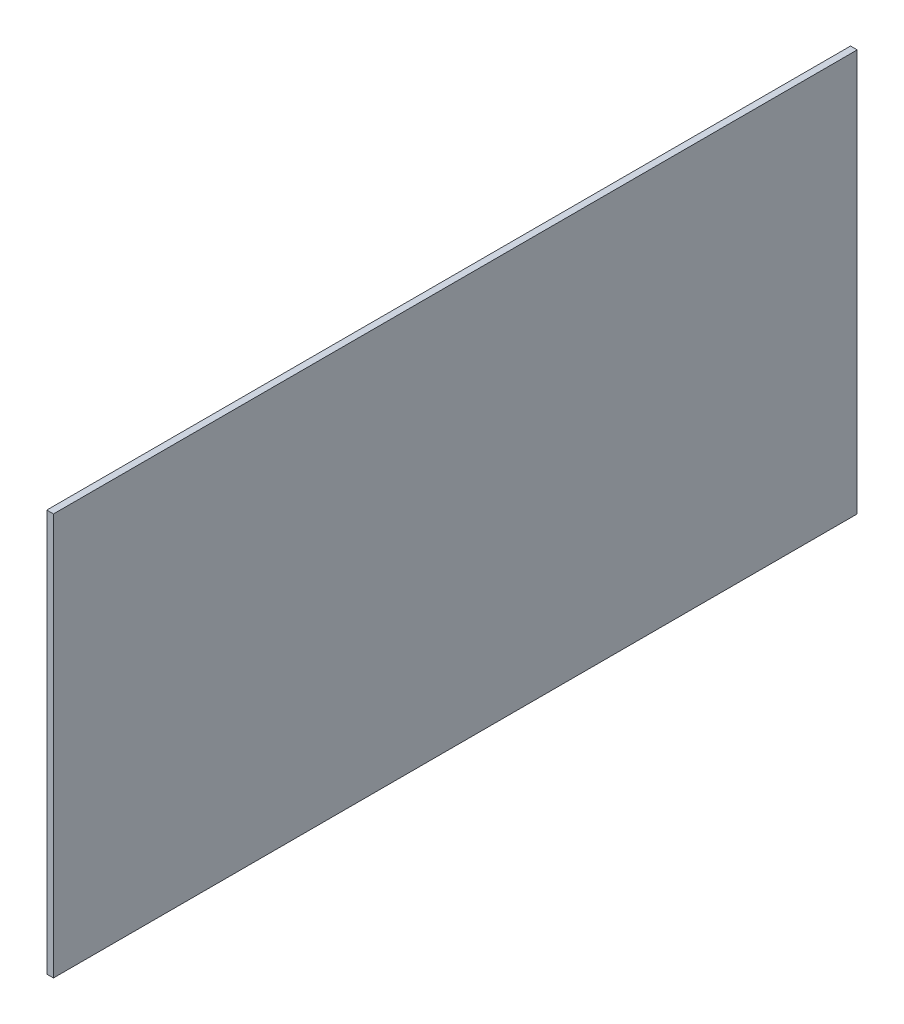
ISO-10303-21;
HEADER;
FILE_DESCRIPTION(('STEP AP214'),'2;1');
FILE_NAME('part.step','',(''),(''),'','','');
FILE_SCHEMA(('AUTOMOTIVE_DESIGN { 1 0 10303 214 1 1 1 1 }'));
ENDSEC;
DATA;
#1=APPLICATION_CONTEXT('core data for automotive mechanical design processes');
#2=APPLICATION_PROTOCOL_DEFINITION('international standard','automotive_design',2000,#1);
#3=PRODUCT_CONTEXT('',#1,'mechanical');
#4=PRODUCT('Part','Part','',(#3));
#5=PRODUCT_RELATED_PRODUCT_CATEGORY('part','',(#4));
#6=PRODUCT_DEFINITION_FORMATION('','',#4);
#7=PRODUCT_DEFINITION_CONTEXT('part definition',#1,'design');
#8=PRODUCT_DEFINITION('design','',#6,#7);
#9=PRODUCT_DEFINITION_SHAPE('','',#8);
#10=(LENGTH_UNIT() NAMED_UNIT(*) SI_UNIT(.MILLI.,.METRE.));
#11=(NAMED_UNIT(*) PLANE_ANGLE_UNIT() SI_UNIT($,.RADIAN.));
#12=(NAMED_UNIT(*) SI_UNIT($,.STERADIAN.) SOLID_ANGLE_UNIT());
#13=UNCERTAINTY_MEASURE_WITH_UNIT(LENGTH_MEASURE(1.E-05),#10,'distance_accuracy_value','');
#14=(GEOMETRIC_REPRESENTATION_CONTEXT(3) GLOBAL_UNCERTAINTY_ASSIGNED_CONTEXT((#13)) GLOBAL_UNIT_ASSIGNED_CONTEXT((#10,
#11,#12)) REPRESENTATION_CONTEXT('',''));
#15=CARTESIAN_POINT('',(0.,0.,0.));
#16=DIRECTION('',(0.,0.,1.));
#17=DIRECTION('',(1.,0.,0.));
#18=AXIS2_PLACEMENT_3D('',#15,#16,#17);
#19=CARTESIAN_POINT('',(5.,-150.,300.));
#20=DIRECTION('',(0.,0.,-1.));
#21=DIRECTION('',(-1.,0.,0.));
#22=AXIS2_PLACEMENT_3D('',#19,#20,#21);
#23=PLANE('',#22);
#24=DIRECTION('',(0.,-1.,0.));
#25=VECTOR('',#24,1.);
#26=CARTESIAN_POINT('',(0.,-150.,300.));
#27=LINE('',#26,#25);
#28=CARTESIAN_POINT('',(0.,150.,300.));
#29=VERTEX_POINT('',#28);
#30=CARTESIAN_POINT('',(0.,-150.,300.));
#31=VERTEX_POINT('',#30);
#32=EDGE_CURVE('E96',#29,#31,#27,.T.);
#33=ORIENTED_EDGE('',*,*,#32,.T.);
#34=DIRECTION('',(-1.,0.,0.));
#35=VECTOR('',#34,1.);
#36=CARTESIAN_POINT('',(5.,-150.,300.));
#37=LINE('',#36,#35);
#38=CARTESIAN_POINT('',(5.,-150.,300.));
#39=VERTEX_POINT('',#38);
#40=EDGE_CURVE('E11',#39,#31,#37,.T.);
#41=ORIENTED_EDGE('',*,*,#40,.F.);
#42=DIRECTION('',(0.,-1.,0.));
#43=VECTOR('',#42,1.);
#44=CARTESIAN_POINT('',(5.,-150.,300.));
#45=LINE('',#44,#43);
#46=CARTESIAN_POINT('',(5.,150.,300.));
#47=VERTEX_POINT('',#46);
#48=EDGE_CURVE('E84',#47,#39,#45,.T.);
#49=ORIENTED_EDGE('',*,*,#48,.F.);
#50=DIRECTION('',(-1.,0.,0.));
#51=VECTOR('',#50,1.);
#52=CARTESIAN_POINT('',(5.,150.,300.));
#53=LINE('',#52,#51);
#54=EDGE_CURVE('E92',#47,#29,#53,.T.);
#55=ORIENTED_EDGE('',*,*,#54,.T.);
#56=EDGE_LOOP('',(#33,#41,#49,#55));
#57=FACE_BOUND('',#56,.T.);
#58=ADVANCED_FACE('F33',(#57),#23,.F.);
#59=CARTESIAN_POINT('',(5.,-150.,-300.));
#60=DIRECTION('',(0.,1.,0.));
#61=DIRECTION('',(0.,0.,1.));
#62=AXIS2_PLACEMENT_3D('',#59,#60,#61);
#63=PLANE('',#62);
#64=DIRECTION('',(0.,0.,-1.));
#65=VECTOR('',#64,1.);
#66=CARTESIAN_POINT('',(0.,-150.,-300.));
#67=LINE('',#66,#65);
#68=CARTESIAN_POINT('',(0.,-150.,-300.));
#69=VERTEX_POINT('',#68);
#70=EDGE_CURVE('E88',#31,#69,#67,.T.);
#71=ORIENTED_EDGE('',*,*,#70,.T.);
#72=DIRECTION('',(-1.,0.,0.));
#73=VECTOR('',#72,1.);
#74=CARTESIAN_POINT('',(5.,-150.,-300.));
#75=LINE('',#74,#73);
#76=CARTESIAN_POINT('',(5.,-150.,-300.));
#77=VERTEX_POINT('',#76);
#78=EDGE_CURVE('E41',#77,#69,#75,.T.);
#79=ORIENTED_EDGE('',*,*,#78,.F.);
#80=DIRECTION('',(0.,0.,-1.));
#81=VECTOR('',#80,1.);
#82=CARTESIAN_POINT('',(5.,-150.,-300.));
#83=LINE('',#82,#81);
#84=EDGE_CURVE('E79',#39,#77,#83,.T.);
#85=ORIENTED_EDGE('',*,*,#84,.F.);
#86=ORIENTED_EDGE('',*,*,#40,.T.);
#87=EDGE_LOOP('',(#71,#79,#85,#86));
#88=FACE_BOUND('',#87,.T.);
#89=ADVANCED_FACE('F87',(#88),#63,.F.);
#90=CARTESIAN_POINT('',(5.,-150.,-300.));
#91=DIRECTION('',(0.,0.,1.));
#92=DIRECTION('',(1.,0.,0.));
#93=AXIS2_PLACEMENT_3D('',#90,#91,#92);
#94=PLANE('',#93);
#95=DIRECTION('',(0.,1.,0.));
#96=VECTOR('',#95,1.);
#97=CARTESIAN_POINT('',(0.,-150.,-300.));
#98=LINE('',#97,#96);
#99=CARTESIAN_POINT('',(0.,150.,-300.));
#100=VERTEX_POINT('',#99);
#101=EDGE_CURVE('E66',#69,#100,#98,.T.);
#102=ORIENTED_EDGE('',*,*,#101,.T.);
#103=DIRECTION('',(-1.,0.,0.));
#104=VECTOR('',#103,1.);
#105=CARTESIAN_POINT('',(5.,150.,-300.));
#106=LINE('',#105,#104);
#107=CARTESIAN_POINT('',(5.,150.,-300.));
#108=VERTEX_POINT('',#107);
#109=EDGE_CURVE('E89',#108,#100,#106,.T.);
#110=ORIENTED_EDGE('',*,*,#109,.F.);
#111=DIRECTION('',(0.,1.,0.));
#112=VECTOR('',#111,1.);
#113=CARTESIAN_POINT('',(5.,-150.,-300.));
#114=LINE('',#113,#112);
#115=EDGE_CURVE('E82',#77,#108,#114,.T.);
#116=ORIENTED_EDGE('',*,*,#115,.F.);
#117=ORIENTED_EDGE('',*,*,#78,.T.);
#118=EDGE_LOOP('',(#102,#110,#116,#117));
#119=FACE_BOUND('',#118,.T.);
#120=ADVANCED_FACE('F90',(#119),#94,.F.);
#121=CARTESIAN_POINT('',(5.,150.,-300.));
#122=DIRECTION('',(0.,-1.,0.));
#123=DIRECTION('',(0.,0.,-1.));
#124=AXIS2_PLACEMENT_3D('',#121,#122,#123);
#125=PLANE('',#124);
#126=DIRECTION('',(0.,0.,1.));
#127=VECTOR('',#126,1.);
#128=CARTESIAN_POINT('',(0.,150.,-300.));
#129=LINE('',#128,#127);
#130=EDGE_CURVE('E72',#100,#29,#129,.T.);
#131=ORIENTED_EDGE('',*,*,#130,.T.);
#132=ORIENTED_EDGE('',*,*,#54,.F.);
#133=DIRECTION('',(0.,0.,1.));
#134=VECTOR('',#133,1.);
#135=CARTESIAN_POINT('',(5.,150.,-300.));
#136=LINE('',#135,#134);
#137=EDGE_CURVE('E49',#108,#47,#136,.T.);
#138=ORIENTED_EDGE('',*,*,#137,.F.);
#139=ORIENTED_EDGE('',*,*,#109,.T.);
#140=EDGE_LOOP('',(#131,#132,#138,#139));
#141=FACE_BOUND('',#140,.T.);
#142=ADVANCED_FACE('F103',(#141),#125,.F.);
#143=CARTESIAN_POINT('',(5.,0.,0.));
#144=DIRECTION('',(1.,0.,0.));
#145=DIRECTION('',(0.,0.,-1.));
#146=AXIS2_PLACEMENT_3D('',#143,#144,#145);
#147=PLANE('',#146);
#148=ORIENTED_EDGE('',*,*,#48,.T.);
#149=ORIENTED_EDGE('',*,*,#84,.T.);
#150=ORIENTED_EDGE('',*,*,#115,.T.);
#151=ORIENTED_EDGE('',*,*,#137,.T.);
#152=EDGE_LOOP('',(#148,#149,#150,#151));
#153=FACE_BOUND('',#152,.T.);
#154=ADVANCED_FACE('F80',(#153),#147,.T.);
#155=CARTESIAN_POINT('',(0.,0.,0.));
#156=DIRECTION('',(1.,0.,0.));
#157=DIRECTION('',(0.,0.,-1.));
#158=AXIS2_PLACEMENT_3D('',#155,#156,#157);
#159=PLANE('',#158);
#160=ORIENTED_EDGE('',*,*,#32,.F.);
#161=ORIENTED_EDGE('',*,*,#130,.F.);
#162=ORIENTED_EDGE('',*,*,#101,.F.);
#163=ORIENTED_EDGE('',*,*,#70,.F.);
#164=EDGE_LOOP('',(#160,#161,#162,#163));
#165=FACE_BOUND('',#164,.T.);
#166=ADVANCED_FACE('F106',(#165),#159,.F.);
#167=CLOSED_SHELL('',(#58,#89,#120,#142,#154,#166));
#168=MANIFOLD_SOLID_BREP('B2',#167);
#169=ADVANCED_BREP_SHAPE_REPRESENTATION('',(#18,#168),#14);
#170=SHAPE_DEFINITION_REPRESENTATION(#9,#169);
ENDSEC;
END-ISO-10303-21;
